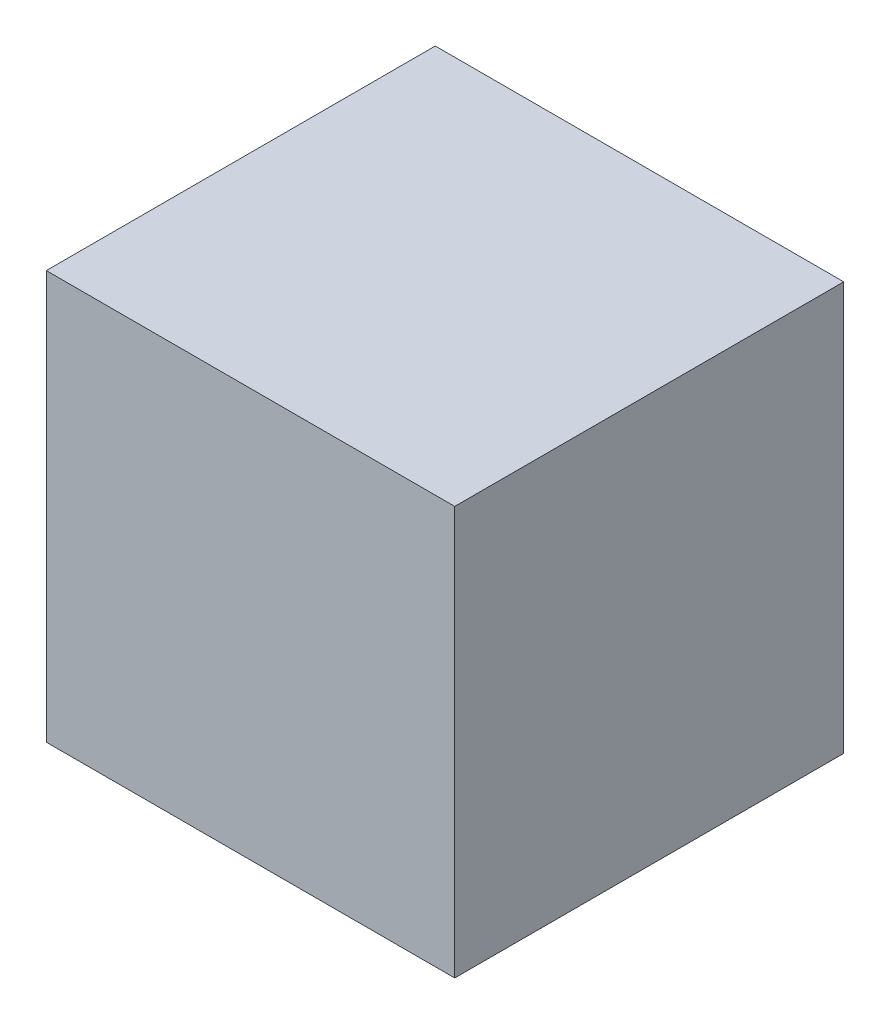
ISO-10303-21;
HEADER;
FILE_DESCRIPTION(('STEP AP214'),'2;1');
FILE_NAME('part.step','',(''),(''),'','','');
FILE_SCHEMA(('AUTOMOTIVE_DESIGN { 1 0 10303 214 1 1 1 1 }'));
ENDSEC;
DATA;
#1=APPLICATION_CONTEXT('core data for automotive mechanical design processes');
#2=APPLICATION_PROTOCOL_DEFINITION('international standard','automotive_design',2000,#1);
#3=PRODUCT_CONTEXT('',#1,'mechanical');
#4=PRODUCT('Part','Part','',(#3));
#5=PRODUCT_RELATED_PRODUCT_CATEGORY('part','',(#4));
#6=PRODUCT_DEFINITION_FORMATION('','',#4);
#7=PRODUCT_DEFINITION_CONTEXT('part definition',#1,'design');
#8=PRODUCT_DEFINITION('design','',#6,#7);
#9=PRODUCT_DEFINITION_SHAPE('','',#8);
#10=(LENGTH_UNIT() NAMED_UNIT(*) SI_UNIT(.MILLI.,.METRE.));
#11=(NAMED_UNIT(*) PLANE_ANGLE_UNIT() SI_UNIT($,.RADIAN.));
#12=(NAMED_UNIT(*) SI_UNIT($,.STERADIAN.) SOLID_ANGLE_UNIT());
#13=UNCERTAINTY_MEASURE_WITH_UNIT(LENGTH_MEASURE(1.E-05),#10,'distance_accuracy_value','');
#14=(GEOMETRIC_REPRESENTATION_CONTEXT(3) GLOBAL_UNCERTAINTY_ASSIGNED_CONTEXT((#13)) GLOBAL_UNIT_ASSIGNED_CONTEXT((#10,
#11,#12)) REPRESENTATION_CONTEXT('',''));
#15=CARTESIAN_POINT('',(0.,0.,0.));
#16=DIRECTION('',(0.,0.,1.));
#17=DIRECTION('',(1.,0.,0.));
#18=AXIS2_PLACEMENT_3D('',#15,#16,#17);
#19=CARTESIAN_POINT('',(21.,-21.,40.));
#20=DIRECTION('',(-1.,0.,0.));
#21=DIRECTION('',(0.,0.,1.));
#22=AXIS2_PLACEMENT_3D('',#19,#20,#21);
#23=PLANE('',#22);
#24=DIRECTION('',(0.,1.,0.));
#25=VECTOR('',#24,1.);
#26=CARTESIAN_POINT('',(21.,-21.,0.));
#27=LINE('',#26,#25);
#28=CARTESIAN_POINT('',(21.,-21.,0.));
#29=VERTEX_POINT('',#28);
#30=CARTESIAN_POINT('',(21.,21.,0.));
#31=VERTEX_POINT('',#30);
#32=EDGE_CURVE('E95',#29,#31,#27,.T.);
#33=ORIENTED_EDGE('',*,*,#32,.T.);
#34=DIRECTION('',(0.,0.,-1.));
#35=VECTOR('',#34,1.);
#36=CARTESIAN_POINT('',(21.,21.,40.));
#37=LINE('',#36,#35);
#38=CARTESIAN_POINT('',(21.,21.,40.));
#39=VERTEX_POINT('',#38);
#40=EDGE_CURVE('E11',#39,#31,#37,.T.);
#41=ORIENTED_EDGE('',*,*,#40,.F.);
#42=DIRECTION('',(0.,1.,0.));
#43=VECTOR('',#42,1.);
#44=CARTESIAN_POINT('',(21.,-21.,40.));
#45=LINE('',#44,#43);
#46=CARTESIAN_POINT('',(21.,-21.,40.));
#47=VERTEX_POINT('',#46);
#48=EDGE_CURVE('E83',#47,#39,#45,.T.);
#49=ORIENTED_EDGE('',*,*,#48,.F.);
#50=DIRECTION('',(0.,0.,-1.));
#51=VECTOR('',#50,1.);
#52=CARTESIAN_POINT('',(21.,-21.,40.));
#53=LINE('',#52,#51);
#54=EDGE_CURVE('E91',#47,#29,#53,.T.);
#55=ORIENTED_EDGE('',*,*,#54,.T.);
#56=EDGE_LOOP('',(#33,#41,#49,#55));
#57=FACE_BOUND('',#56,.T.);
#58=ADVANCED_FACE('F32',(#57),#23,.F.);
#59=CARTESIAN_POINT('',(-21.,21.,40.));
#60=DIRECTION('',(0.,-1.,0.));
#61=DIRECTION('',(0.,0.,-1.));
#62=AXIS2_PLACEMENT_3D('',#59,#60,#61);
#63=PLANE('',#62);
#64=DIRECTION('',(-1.,0.,0.));
#65=VECTOR('',#64,1.);
#66=CARTESIAN_POINT('',(-21.,21.,0.));
#67=LINE('',#66,#65);
#68=CARTESIAN_POINT('',(-21.,21.,0.));
#69=VERTEX_POINT('',#68);
#70=EDGE_CURVE('E87',#31,#69,#67,.T.);
#71=ORIENTED_EDGE('',*,*,#70,.T.);
#72=DIRECTION('',(0.,0.,-1.));
#73=VECTOR('',#72,1.);
#74=CARTESIAN_POINT('',(-21.,21.,40.));
#75=LINE('',#74,#73);
#76=CARTESIAN_POINT('',(-21.,21.,40.));
#77=VERTEX_POINT('',#76);
#78=EDGE_CURVE('E40',#77,#69,#75,.T.);
#79=ORIENTED_EDGE('',*,*,#78,.F.);
#80=DIRECTION('',(-1.,0.,0.));
#81=VECTOR('',#80,1.);
#82=CARTESIAN_POINT('',(-21.,21.,40.));
#83=LINE('',#82,#81);
#84=EDGE_CURVE('E78',#39,#77,#83,.T.);
#85=ORIENTED_EDGE('',*,*,#84,.F.);
#86=ORIENTED_EDGE('',*,*,#40,.T.);
#87=EDGE_LOOP('',(#71,#79,#85,#86));
#88=FACE_BOUND('',#87,.T.);
#89=ADVANCED_FACE('F86',(#88),#63,.F.);
#90=CARTESIAN_POINT('',(-21.,-21.,40.));
#91=DIRECTION('',(1.,0.,0.));
#92=DIRECTION('',(0.,0.,-1.));
#93=AXIS2_PLACEMENT_3D('',#90,#91,#92);
#94=PLANE('',#93);
#95=DIRECTION('',(0.,-1.,0.));
#96=VECTOR('',#95,1.);
#97=CARTESIAN_POINT('',(-21.,-21.,0.));
#98=LINE('',#97,#96);
#99=CARTESIAN_POINT('',(-21.,-21.,0.));
#100=VERTEX_POINT('',#99);
#101=EDGE_CURVE('E65',#69,#100,#98,.T.);
#102=ORIENTED_EDGE('',*,*,#101,.T.);
#103=DIRECTION('',(0.,0.,-1.));
#104=VECTOR('',#103,1.);
#105=CARTESIAN_POINT('',(-21.,-21.,40.));
#106=LINE('',#105,#104);
#107=CARTESIAN_POINT('',(-21.,-21.,40.));
#108=VERTEX_POINT('',#107);
#109=EDGE_CURVE('E88',#108,#100,#106,.T.);
#110=ORIENTED_EDGE('',*,*,#109,.F.);
#111=DIRECTION('',(0.,-1.,0.));
#112=VECTOR('',#111,1.);
#113=CARTESIAN_POINT('',(-21.,-21.,40.));
#114=LINE('',#113,#112);
#115=EDGE_CURVE('E81',#77,#108,#114,.T.);
#116=ORIENTED_EDGE('',*,*,#115,.F.);
#117=ORIENTED_EDGE('',*,*,#78,.T.);
#118=EDGE_LOOP('',(#102,#110,#116,#117));
#119=FACE_BOUND('',#118,.T.);
#120=ADVANCED_FACE('F89',(#119),#94,.F.);
#121=CARTESIAN_POINT('',(-21.,-21.,40.));
#122=DIRECTION('',(0.,1.,0.));
#123=DIRECTION('',(0.,0.,1.));
#124=AXIS2_PLACEMENT_3D('',#121,#122,#123);
#125=PLANE('',#124);
#126=DIRECTION('',(1.,0.,0.));
#127=VECTOR('',#126,1.);
#128=CARTESIAN_POINT('',(-21.,-21.,0.));
#129=LINE('',#128,#127);
#130=EDGE_CURVE('E71',#100,#29,#129,.T.);
#131=ORIENTED_EDGE('',*,*,#130,.T.);
#132=ORIENTED_EDGE('',*,*,#54,.F.);
#133=DIRECTION('',(1.,0.,0.));
#134=VECTOR('',#133,1.);
#135=CARTESIAN_POINT('',(-21.,-21.,40.));
#136=LINE('',#135,#134);
#137=EDGE_CURVE('E48',#108,#47,#136,.T.);
#138=ORIENTED_EDGE('',*,*,#137,.F.);
#139=ORIENTED_EDGE('',*,*,#109,.T.);
#140=EDGE_LOOP('',(#131,#132,#138,#139));
#141=FACE_BOUND('',#140,.T.);
#142=ADVANCED_FACE('F102',(#141),#125,.F.);
#143=CARTESIAN_POINT('',(0.,0.,40.));
#144=DIRECTION('',(0.,0.,-1.));
#145=DIRECTION('',(-1.,0.,0.));
#146=AXIS2_PLACEMENT_3D('',#143,#144,#145);
#147=PLANE('',#146);
#148=ORIENTED_EDGE('',*,*,#48,.T.);
#149=ORIENTED_EDGE('',*,*,#84,.T.);
#150=ORIENTED_EDGE('',*,*,#115,.T.);
#151=ORIENTED_EDGE('',*,*,#137,.T.);
#152=EDGE_LOOP('',(#148,#149,#150,#151));
#153=FACE_BOUND('',#152,.T.);
#154=ADVANCED_FACE('F79',(#153),#147,.F.);
#155=CARTESIAN_POINT('',(0.,0.,0.));
#156=DIRECTION('',(0.,0.,-1.));
#157=DIRECTION('',(-1.,0.,0.));
#158=AXIS2_PLACEMENT_3D('',#155,#156,#157);
#159=PLANE('',#158);
#160=ORIENTED_EDGE('',*,*,#32,.F.);
#161=ORIENTED_EDGE('',*,*,#130,.F.);
#162=ORIENTED_EDGE('',*,*,#101,.F.);
#163=ORIENTED_EDGE('',*,*,#70,.F.);
#164=EDGE_LOOP('',(#160,#161,#162,#163));
#165=FACE_BOUND('',#164,.T.);
#166=ADVANCED_FACE('F105',(#165),#159,.T.);
#167=CLOSED_SHELL('',(#58,#89,#120,#142,#154,#166));
#168=MANIFOLD_SOLID_BREP('B2',#167);
#169=ADVANCED_BREP_SHAPE_REPRESENTATION('',(#18,#168),#14);
#170=SHAPE_DEFINITION_REPRESENTATION(#9,#169);
ENDSEC;
END-ISO-10303-21;
